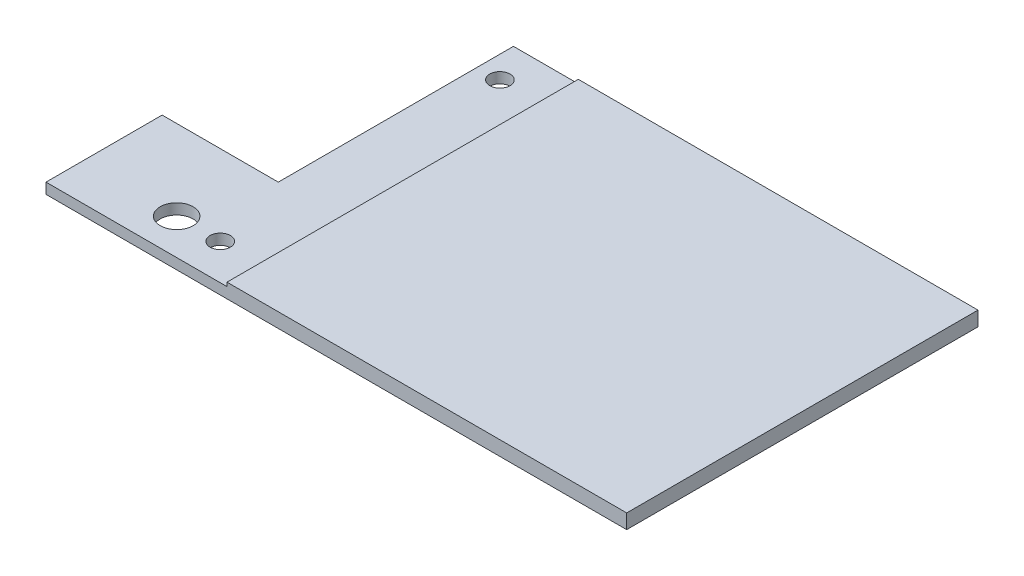
ISO-10303-21;
HEADER;
FILE_DESCRIPTION(('STEP AP214'),'2;1');
FILE_NAME('part.step','',(''),(''),'','','');
FILE_SCHEMA(('AUTOMOTIVE_DESIGN { 1 0 10303 214 1 1 1 1 }'));
ENDSEC;
DATA;
#1=APPLICATION_CONTEXT('core data for automotive mechanical design processes');
#2=APPLICATION_PROTOCOL_DEFINITION('international standard','automotive_design',2000,#1);
#3=PRODUCT_CONTEXT('',#1,'mechanical');
#4=PRODUCT('Part','Part','',(#3));
#5=PRODUCT_RELATED_PRODUCT_CATEGORY('part','',(#4));
#6=PRODUCT_DEFINITION_FORMATION('','',#4);
#7=PRODUCT_DEFINITION_CONTEXT('part definition',#1,'design');
#8=PRODUCT_DEFINITION('design','',#6,#7);
#9=PRODUCT_DEFINITION_SHAPE('','',#8);
#10=(LENGTH_UNIT() NAMED_UNIT(*) SI_UNIT(.MILLI.,.METRE.));
#11=(NAMED_UNIT(*) PLANE_ANGLE_UNIT() SI_UNIT($,.RADIAN.));
#12=(NAMED_UNIT(*) SI_UNIT($,.STERADIAN.) SOLID_ANGLE_UNIT());
#13=UNCERTAINTY_MEASURE_WITH_UNIT(LENGTH_MEASURE(1.E-05),#10,'distance_accuracy_value','');
#14=(GEOMETRIC_REPRESENTATION_CONTEXT(3) GLOBAL_UNCERTAINTY_ASSIGNED_CONTEXT((#13)) GLOBAL_UNIT_ASSIGNED_CONTEXT((#10,
#11,#12)) REPRESENTATION_CONTEXT('',''));
#15=CARTESIAN_POINT('',(0.,0.,0.));
#16=DIRECTION('',(0.,0.,1.));
#17=DIRECTION('',(1.,0.,0.));
#18=AXIS2_PLACEMENT_3D('',#15,#16,#17);
#19=CARTESIAN_POINT('',(0.,1.397,0.));
#20=DIRECTION('',(0.,1.,0.));
#21=DIRECTION('',(0.,0.,1.));
#22=AXIS2_PLACEMENT_3D('',#19,#20,#21);
#23=PLANE('',#22);
#24=CARTESIAN_POINT('',(12.446,1.397,-4.699));
#25=DIRECTION('',(0.,1.,0.));
#26=DIRECTION('',(0.,0.,1.));
#27=AXIS2_PLACEMENT_3D('',#24,#25,#26);
#28=CIRCLE('',#27,2.159);
#29=CARTESIAN_POINT('',(12.446,1.397,-2.54));
#30=VERTEX_POINT('',#29);
#31=EDGE_CURVE('E135',#30,#30,#28,.T.);
#32=ORIENTED_EDGE('',*,*,#31,.F.);
#33=EDGE_LOOP('',(#32));
#34=FACE_BOUND('',#33,.T.);
#35=CARTESIAN_POINT('',(18.161,1.397,-41.402));
#36=DIRECTION('',(0.,1.,0.));
#37=DIRECTION('',(0.,0.,1.));
#38=AXIS2_PLACEMENT_3D('',#35,#36,#37);
#39=CIRCLE('',#38,1.33073304152281);
#40=CARTESIAN_POINT('',(18.161,1.397,-40.0712669584772));
#41=VERTEX_POINT('',#40);
#42=EDGE_CURVE('E131',#41,#41,#39,.T.);
#43=ORIENTED_EDGE('',*,*,#42,.F.);
#44=EDGE_LOOP('',(#43));
#45=FACE_BOUND('',#44,.T.);
#46=CARTESIAN_POINT('',(18.161,1.397,-4.699));
#47=DIRECTION('',(0.,1.,0.));
#48=DIRECTION('',(0.,0.,1.));
#49=AXIS2_PLACEMENT_3D('',#46,#47,#48);
#50=CIRCLE('',#49,1.33073304152281);
#51=CARTESIAN_POINT('',(18.161,1.397,-3.36826695847719));
#52=VERTEX_POINT('',#51);
#53=EDGE_CURVE('E128',#52,#52,#50,.T.);
#54=ORIENTED_EDGE('',*,*,#53,.F.);
#55=EDGE_LOOP('',(#54));
#56=FACE_BOUND('',#55,.T.);
#57=DIRECTION('',(1.,0.,0.));
#58=VECTOR('',#57,1.);
#59=CARTESIAN_POINT('',(0.,1.397,0.));
#60=LINE('',#59,#58);
#61=CARTESIAN_POINT('',(0.,1.397,0.));
#62=VERTEX_POINT('',#61);
#63=CARTESIAN_POINT('',(23.751175609156,1.397,0.));
#64=VERTEX_POINT('',#63);
#65=EDGE_CURVE('E53',#62,#64,#60,.T.);
#66=ORIENTED_EDGE('',*,*,#65,.T.);
#67=DIRECTION('',(0.,0.,-1.));
#68=VECTOR('',#67,1.);
#69=CARTESIAN_POINT('',(23.751175609156,1.397,0.));
#70=LINE('',#69,#68);
#71=CARTESIAN_POINT('',(23.751175609156,1.397,-46.101));
#72=VERTEX_POINT('',#71);
#73=EDGE_CURVE('E48',#64,#72,#70,.T.);
#74=ORIENTED_EDGE('',*,*,#73,.T.);
#75=DIRECTION('',(1.,0.,0.));
#76=VECTOR('',#75,1.);
#77=CARTESIAN_POINT('',(0.,1.397,-46.101));
#78=LINE('',#77,#76);
#79=CARTESIAN_POINT('',(15.24,1.397,-46.101));
#80=VERTEX_POINT('',#79);
#81=EDGE_CURVE('E104',#80,#72,#78,.T.);
#82=ORIENTED_EDGE('',*,*,#81,.F.);
#83=DIRECTION('',(0.,0.,-1.));
#84=VECTOR('',#83,1.);
#85=CARTESIAN_POINT('',(15.24,1.397,0.));
#86=LINE('',#85,#84);
#87=CARTESIAN_POINT('',(15.24,1.397,-15.24));
#88=VERTEX_POINT('',#87);
#89=EDGE_CURVE('E140',#88,#80,#86,.T.);
#90=ORIENTED_EDGE('',*,*,#89,.F.);
#91=DIRECTION('',(-1.,0.,0.));
#92=VECTOR('',#91,1.);
#93=CARTESIAN_POINT('',(0.,1.397,-15.24));
#94=LINE('',#93,#92);
#95=CARTESIAN_POINT('',(0.,1.397,-15.24));
#96=VERTEX_POINT('',#95);
#97=EDGE_CURVE('E143',#88,#96,#94,.T.);
#98=ORIENTED_EDGE('',*,*,#97,.T.);
#99=DIRECTION('',(0.,0.,-1.));
#100=VECTOR('',#99,1.);
#101=CARTESIAN_POINT('',(0.,1.397,0.));
#102=LINE('',#101,#100);
#103=EDGE_CURVE('E145',#62,#96,#102,.T.);
#104=ORIENTED_EDGE('',*,*,#103,.F.);
#105=EDGE_LOOP('',(#66,#74,#82,#90,#98,#104));
#106=FACE_BOUND('',#105,.T.);
#107=ADVANCED_FACE('F33',(#34,#45,#56,#106),#23,.T.);
#108=CARTESIAN_POINT('',(0.,1.397,0.));
#109=DIRECTION('',(0.,0.,-1.));
#110=DIRECTION('',(-1.,0.,0.));
#111=AXIS2_PLACEMENT_3D('',#108,#109,#110);
#112=PLANE('',#111);
#113=DIRECTION('',(0.,-1.,0.));
#114=VECTOR('',#113,1.);
#115=CARTESIAN_POINT('',(76.2,1.397,0.));
#116=LINE('',#115,#114);
#117=CARTESIAN_POINT('',(76.2,1.905,0.));
#118=VERTEX_POINT('',#117);
#119=CARTESIAN_POINT('',(76.2,0.,0.));
#120=VERTEX_POINT('',#119);
#121=EDGE_CURVE('E11',#118,#120,#116,.T.);
#122=ORIENTED_EDGE('',*,*,#121,.F.);
#123=DIRECTION('',(1.,0.,0.));
#124=VECTOR('',#123,1.);
#125=CARTESIAN_POINT('',(0.,1.905,0.));
#126=LINE('',#125,#124);
#127=CARTESIAN_POINT('',(23.751175609156,1.905,0.));
#128=VERTEX_POINT('',#127);
#129=EDGE_CURVE('E115',#128,#118,#126,.T.);
#130=ORIENTED_EDGE('',*,*,#129,.F.);
#131=DIRECTION('',(0.,-1.,0.));
#132=VECTOR('',#131,1.);
#133=CARTESIAN_POINT('',(23.751175609156,1.905,0.));
#134=LINE('',#133,#132);
#135=EDGE_CURVE('E106',#128,#64,#134,.T.);
#136=ORIENTED_EDGE('',*,*,#135,.T.);
#137=ORIENTED_EDGE('',*,*,#65,.F.);
#138=DIRECTION('',(0.,-1.,0.));
#139=VECTOR('',#138,1.);
#140=CARTESIAN_POINT('',(0.,1.397,0.));
#141=LINE('',#140,#139);
#142=CARTESIAN_POINT('',(0.,0.,0.));
#143=VERTEX_POINT('',#142);
#144=EDGE_CURVE('E148',#62,#143,#141,.T.);
#145=ORIENTED_EDGE('',*,*,#144,.T.);
#146=DIRECTION('',(1.,0.,0.));
#147=VECTOR('',#146,1.);
#148=CARTESIAN_POINT('',(0.,0.,0.));
#149=LINE('',#148,#147);
#150=EDGE_CURVE('E157',#143,#120,#149,.T.);
#151=ORIENTED_EDGE('',*,*,#150,.T.);
#152=EDGE_LOOP('',(#122,#130,#136,#137,#145,#151));
#153=FACE_BOUND('',#152,.T.);
#154=ADVANCED_FACE('F199',(#153),#112,.F.);
#155=CARTESIAN_POINT('',(76.2,1.397,0.));
#156=DIRECTION('',(-1.,0.,0.));
#157=DIRECTION('',(0.,0.,1.));
#158=AXIS2_PLACEMENT_3D('',#155,#156,#157);
#159=PLANE('',#158);
#160=DIRECTION('',(0.,0.,-1.));
#161=VECTOR('',#160,1.);
#162=CARTESIAN_POINT('',(76.2,0.,0.));
#163=LINE('',#162,#161);
#164=CARTESIAN_POINT('',(76.2,0.,-46.101));
#165=VERTEX_POINT('',#164);
#166=EDGE_CURVE('E159',#120,#165,#163,.T.);
#167=ORIENTED_EDGE('',*,*,#166,.T.);
#168=DIRECTION('',(0.,-1.,0.));
#169=VECTOR('',#168,1.);
#170=CARTESIAN_POINT('',(76.2,1.397,-46.101));
#171=LINE('',#170,#169);
#172=CARTESIAN_POINT('',(76.2,1.905,-46.101));
#173=VERTEX_POINT('',#172);
#174=EDGE_CURVE('E41',#173,#165,#171,.T.);
#175=ORIENTED_EDGE('',*,*,#174,.F.);
#176=DIRECTION('',(0.,0.,-1.));
#177=VECTOR('',#176,1.);
#178=CARTESIAN_POINT('',(76.2,1.905,0.));
#179=LINE('',#178,#177);
#180=EDGE_CURVE('E120',#118,#173,#179,.T.);
#181=ORIENTED_EDGE('',*,*,#180,.F.);
#182=ORIENTED_EDGE('',*,*,#121,.T.);
#183=EDGE_LOOP('',(#167,#175,#181,#182));
#184=FACE_BOUND('',#183,.T.);
#185=ADVANCED_FACE('F181',(#184),#159,.F.);
#186=CARTESIAN_POINT('',(0.,1.397,-46.101));
#187=DIRECTION('',(0.,0.,-1.));
#188=DIRECTION('',(-1.,0.,0.));
#189=AXIS2_PLACEMENT_3D('',#186,#187,#188);
#190=PLANE('',#189);
#191=ORIENTED_EDGE('',*,*,#174,.T.);
#192=DIRECTION('',(1.,0.,0.));
#193=VECTOR('',#192,1.);
#194=CARTESIAN_POINT('',(0.,0.,-46.101));
#195=LINE('',#194,#193);
#196=CARTESIAN_POINT('',(15.24,0.,-46.101));
#197=VERTEX_POINT('',#196);
#198=EDGE_CURVE('E162',#197,#165,#195,.T.);
#199=ORIENTED_EDGE('',*,*,#198,.F.);
#200=DIRECTION('',(0.,-1.,0.));
#201=VECTOR('',#200,1.);
#202=CARTESIAN_POINT('',(15.24,1.397,-46.101));
#203=LINE('',#202,#201);
#204=EDGE_CURVE('E177',#80,#197,#203,.T.);
#205=ORIENTED_EDGE('',*,*,#204,.F.);
#206=ORIENTED_EDGE('',*,*,#81,.T.);
#207=DIRECTION('',(0.,-1.,0.));
#208=VECTOR('',#207,1.);
#209=CARTESIAN_POINT('',(23.751175609156,1.905,-46.101));
#210=LINE('',#209,#208);
#211=CARTESIAN_POINT('',(23.751175609156,1.905,-46.101));
#212=VERTEX_POINT('',#211);
#213=EDGE_CURVE('E98',#212,#72,#210,.T.);
#214=ORIENTED_EDGE('',*,*,#213,.F.);
#215=DIRECTION('',(1.,0.,0.));
#216=VECTOR('',#215,1.);
#217=CARTESIAN_POINT('',(0.,1.905,-46.101));
#218=LINE('',#217,#216);
#219=EDGE_CURVE('E103',#212,#173,#218,.T.);
#220=ORIENTED_EDGE('',*,*,#219,.T.);
#221=EDGE_LOOP('',(#191,#199,#205,#206,#214,#220));
#222=FACE_BOUND('',#221,.T.);
#223=ADVANCED_FACE('F101',(#222),#190,.T.);
#224=CARTESIAN_POINT('',(15.24,1.397,0.));
#225=DIRECTION('',(-1.,0.,0.));
#226=DIRECTION('',(0.,0.,1.));
#227=AXIS2_PLACEMENT_3D('',#224,#225,#226);
#228=PLANE('',#227);
#229=DIRECTION('',(0.,0.,-1.));
#230=VECTOR('',#229,1.);
#231=CARTESIAN_POINT('',(15.24,0.,0.));
#232=LINE('',#231,#230);
#233=CARTESIAN_POINT('',(15.24,0.,-15.24));
#234=VERTEX_POINT('',#233);
#235=EDGE_CURVE('E164',#234,#197,#232,.T.);
#236=ORIENTED_EDGE('',*,*,#235,.F.);
#237=DIRECTION('',(0.,-1.,0.));
#238=VECTOR('',#237,1.);
#239=CARTESIAN_POINT('',(15.24,1.397,-15.24));
#240=LINE('',#239,#238);
#241=EDGE_CURVE('E175',#88,#234,#240,.T.);
#242=ORIENTED_EDGE('',*,*,#241,.F.);
#243=ORIENTED_EDGE('',*,*,#89,.T.);
#244=ORIENTED_EDGE('',*,*,#204,.T.);
#245=EDGE_LOOP('',(#236,#242,#243,#244));
#246=FACE_BOUND('',#245,.T.);
#247=ADVANCED_FACE('F190',(#246),#228,.T.);
#248=CARTESIAN_POINT('',(0.,1.397,-15.24));
#249=DIRECTION('',(0.,0.,1.));
#250=DIRECTION('',(1.,0.,0.));
#251=AXIS2_PLACEMENT_3D('',#248,#249,#250);
#252=PLANE('',#251);
#253=DIRECTION('',(-1.,0.,0.));
#254=VECTOR('',#253,1.);
#255=CARTESIAN_POINT('',(0.,0.,-15.24));
#256=LINE('',#255,#254);
#257=CARTESIAN_POINT('',(0.,0.,-15.24));
#258=VERTEX_POINT('',#257);
#259=EDGE_CURVE('E167',#234,#258,#256,.T.);
#260=ORIENTED_EDGE('',*,*,#259,.T.);
#261=DIRECTION('',(0.,-1.,0.));
#262=VECTOR('',#261,1.);
#263=CARTESIAN_POINT('',(0.,1.397,-15.24));
#264=LINE('',#263,#262);
#265=EDGE_CURVE('E173',#96,#258,#264,.T.);
#266=ORIENTED_EDGE('',*,*,#265,.F.);
#267=ORIENTED_EDGE('',*,*,#97,.F.);
#268=ORIENTED_EDGE('',*,*,#241,.T.);
#269=EDGE_LOOP('',(#260,#266,#267,#268));
#270=FACE_BOUND('',#269,.T.);
#271=ADVANCED_FACE('F195',(#270),#252,.F.);
#272=CARTESIAN_POINT('',(12.446,1.397,-4.699));
#273=DIRECTION('',(0.,-1.,0.));
#274=DIRECTION('',(0.,0.,-1.));
#275=AXIS2_PLACEMENT_3D('',#272,#273,#274);
#276=CYLINDRICAL_SURFACE('',#275,2.159);
#277=ORIENTED_EDGE('',*,*,#31,.T.);
#278=EDGE_LOOP('',(#277));
#279=FACE_BOUND('',#278,.T.);
#280=CARTESIAN_POINT('',(12.446,0.,-4.699));
#281=DIRECTION('',(0.,1.,0.));
#282=DIRECTION('',(0.,0.,1.));
#283=AXIS2_PLACEMENT_3D('',#280,#281,#282);
#284=CIRCLE('',#283,2.159);
#285=CARTESIAN_POINT('',(12.446,0.,-2.54));
#286=VERTEX_POINT('',#285);
#287=EDGE_CURVE('E154',#286,#286,#284,.T.);
#288=ORIENTED_EDGE('',*,*,#287,.F.);
#289=EDGE_LOOP('',(#288));
#290=FACE_BOUND('',#289,.T.);
#291=ADVANCED_FACE('F211',(#279,#290),#276,.F.);
#292=CARTESIAN_POINT('',(18.161,1.397,-41.402));
#293=DIRECTION('',(0.,-1.,0.));
#294=DIRECTION('',(0.,0.,-1.));
#295=AXIS2_PLACEMENT_3D('',#292,#293,#294);
#296=CYLINDRICAL_SURFACE('',#295,1.33073304152281);
#297=ORIENTED_EDGE('',*,*,#42,.T.);
#298=EDGE_LOOP('',(#297));
#299=FACE_BOUND('',#298,.T.);
#300=CARTESIAN_POINT('',(18.161,0.,-41.402));
#301=DIRECTION('',(0.,1.,0.));
#302=DIRECTION('',(0.,0.,1.));
#303=AXIS2_PLACEMENT_3D('',#300,#301,#302);
#304=CIRCLE('',#303,1.33073304152281);
#305=CARTESIAN_POINT('',(18.161,0.,-40.0712669584772));
#306=VERTEX_POINT('',#305);
#307=EDGE_CURVE('E151',#306,#306,#304,.T.);
#308=ORIENTED_EDGE('',*,*,#307,.F.);
#309=EDGE_LOOP('',(#308));
#310=FACE_BOUND('',#309,.T.);
#311=ADVANCED_FACE('F213',(#299,#310),#296,.F.);
#312=CARTESIAN_POINT('',(18.161,1.397,-4.699));
#313=DIRECTION('',(0.,-1.,0.));
#314=DIRECTION('',(0.,0.,-1.));
#315=AXIS2_PLACEMENT_3D('',#312,#313,#314);
#316=CYLINDRICAL_SURFACE('',#315,1.33073304152281);
#317=ORIENTED_EDGE('',*,*,#53,.T.);
#318=EDGE_LOOP('',(#317));
#319=FACE_BOUND('',#318,.T.);
#320=CARTESIAN_POINT('',(18.161,0.,-4.699));
#321=DIRECTION('',(0.,1.,0.));
#322=DIRECTION('',(0.,0.,1.));
#323=AXIS2_PLACEMENT_3D('',#320,#321,#322);
#324=CIRCLE('',#323,1.33073304152281);
#325=CARTESIAN_POINT('',(18.161,0.,-3.36826695847719));
#326=VERTEX_POINT('',#325);
#327=EDGE_CURVE('E127',#326,#326,#324,.T.);
#328=ORIENTED_EDGE('',*,*,#327,.F.);
#329=EDGE_LOOP('',(#328));
#330=FACE_BOUND('',#329,.T.);
#331=ADVANCED_FACE('F35',(#319,#330),#316,.F.);
#332=CARTESIAN_POINT('',(0.,1.397,0.));
#333=DIRECTION('',(-1.,0.,0.));
#334=DIRECTION('',(0.,0.,1.));
#335=AXIS2_PLACEMENT_3D('',#332,#333,#334);
#336=PLANE('',#335);
#337=DIRECTION('',(0.,0.,-1.));
#338=VECTOR('',#337,1.);
#339=CARTESIAN_POINT('',(0.,0.,0.));
#340=LINE('',#339,#338);
#341=EDGE_CURVE('E132',#143,#258,#340,.T.);
#342=ORIENTED_EDGE('',*,*,#341,.F.);
#343=ORIENTED_EDGE('',*,*,#144,.F.);
#344=ORIENTED_EDGE('',*,*,#103,.T.);
#345=ORIENTED_EDGE('',*,*,#265,.T.);
#346=EDGE_LOOP('',(#342,#343,#344,#345));
#347=FACE_BOUND('',#346,.T.);
#348=ADVANCED_FACE('F197',(#347),#336,.T.);
#349=CARTESIAN_POINT('',(0.,0.,0.));
#350=DIRECTION('',(0.,1.,0.));
#351=DIRECTION('',(0.,0.,1.));
#352=AXIS2_PLACEMENT_3D('',#349,#350,#351);
#353=PLANE('',#352);
#354=ORIENTED_EDGE('',*,*,#166,.F.);
#355=ORIENTED_EDGE('',*,*,#150,.F.);
#356=ORIENTED_EDGE('',*,*,#341,.T.);
#357=ORIENTED_EDGE('',*,*,#259,.F.);
#358=ORIENTED_EDGE('',*,*,#235,.T.);
#359=ORIENTED_EDGE('',*,*,#198,.T.);
#360=EDGE_LOOP('',(#354,#355,#356,#357,#358,#359));
#361=FACE_BOUND('',#360,.T.);
#362=ORIENTED_EDGE('',*,*,#287,.T.);
#363=EDGE_LOOP('',(#362));
#364=FACE_BOUND('',#363,.T.);
#365=ORIENTED_EDGE('',*,*,#307,.T.);
#366=EDGE_LOOP('',(#365));
#367=FACE_BOUND('',#366,.T.);
#368=ORIENTED_EDGE('',*,*,#327,.T.);
#369=EDGE_LOOP('',(#368));
#370=FACE_BOUND('',#369,.T.);
#371=ADVANCED_FACE('F184',(#361,#364,#367,#370),#353,.F.);
#372=CARTESIAN_POINT('',(23.751175609156,1.905,0.));
#373=DIRECTION('',(1.,0.,0.));
#374=DIRECTION('',(0.,0.,-1.));
#375=AXIS2_PLACEMENT_3D('',#372,#373,#374);
#376=PLANE('',#375);
#377=ORIENTED_EDGE('',*,*,#73,.F.);
#378=ORIENTED_EDGE('',*,*,#135,.F.);
#379=DIRECTION('',(0.,0.,1.));
#380=VECTOR('',#379,1.);
#381=CARTESIAN_POINT('',(23.751175609156,1.905,0.));
#382=LINE('',#381,#380);
#383=EDGE_CURVE('E109',#212,#128,#382,.T.);
#384=ORIENTED_EDGE('',*,*,#383,.F.);
#385=ORIENTED_EDGE('',*,*,#213,.T.);
#386=EDGE_LOOP('',(#377,#378,#384,#385));
#387=FACE_BOUND('',#386,.T.);
#388=ADVANCED_FACE('F110',(#387),#376,.F.);
#389=CARTESIAN_POINT('',(0.,1.905,0.));
#390=DIRECTION('',(0.,1.,0.));
#391=DIRECTION('',(0.,0.,1.));
#392=AXIS2_PLACEMENT_3D('',#389,#390,#391);
#393=PLANE('',#392);
#394=ORIENTED_EDGE('',*,*,#219,.F.);
#395=ORIENTED_EDGE('',*,*,#383,.T.);
#396=ORIENTED_EDGE('',*,*,#129,.T.);
#397=ORIENTED_EDGE('',*,*,#180,.T.);
#398=EDGE_LOOP('',(#394,#395,#396,#397));
#399=FACE_BOUND('',#398,.T.);
#400=ADVANCED_FACE('F118',(#399),#393,.T.);
#401=CLOSED_SHELL('',(#107,#154,#185,#223,#247,#271,#291,#311,#331,#348,#371,#388,#400));
#402=MANIFOLD_SOLID_BREP('B2',#401);
#403=ADVANCED_BREP_SHAPE_REPRESENTATION('',(#18,#402),#14);
#404=SHAPE_DEFINITION_REPRESENTATION(#9,#403);
ENDSEC;
END-ISO-10303-21;
